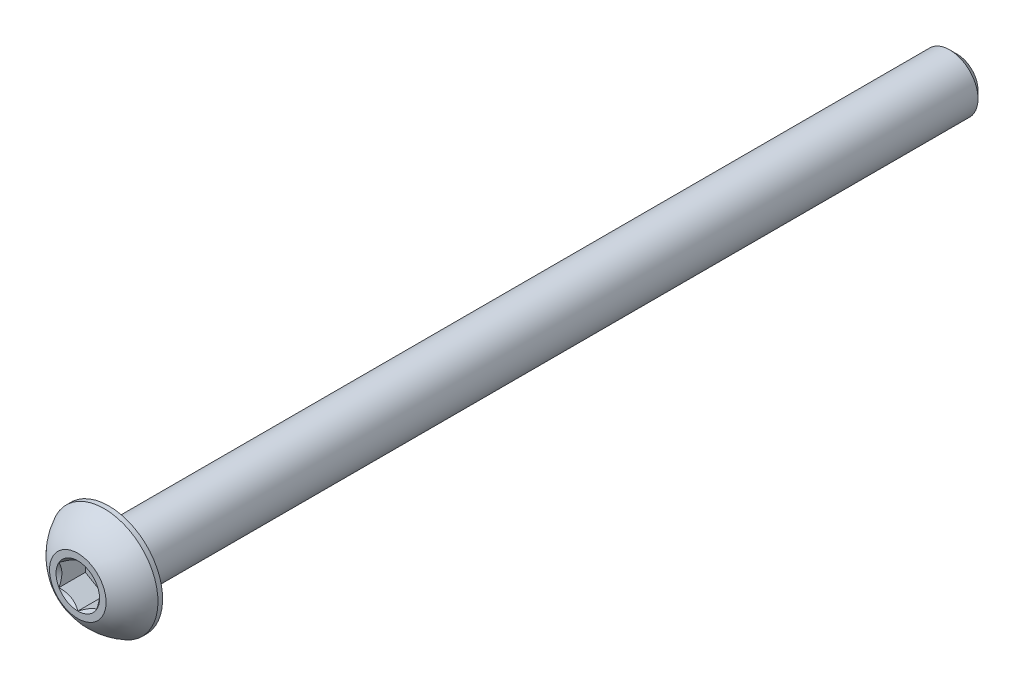
ISO-10303-21;
HEADER;
FILE_DESCRIPTION(('STEP AP214'),'2;1');
FILE_NAME('part.step','',(''),(''),'','','');
FILE_SCHEMA(('AUTOMOTIVE_DESIGN { 1 0 10303 214 1 1 1 1 }'));
ENDSEC;
DATA;
#1=APPLICATION_CONTEXT('core data for automotive mechanical design processes');
#2=APPLICATION_PROTOCOL_DEFINITION('international standard','automotive_design',2000,#1);
#3=PRODUCT_CONTEXT('',#1,'mechanical');
#4=PRODUCT('Part','Part','',(#3));
#5=PRODUCT_RELATED_PRODUCT_CATEGORY('part','',(#4));
#6=PRODUCT_DEFINITION_FORMATION('','',#4);
#7=PRODUCT_DEFINITION_CONTEXT('part definition',#1,'design');
#8=PRODUCT_DEFINITION('design','',#6,#7);
#9=PRODUCT_DEFINITION_SHAPE('','',#8);
#10=(LENGTH_UNIT() NAMED_UNIT(*) SI_UNIT(.MILLI.,.METRE.));
#11=(NAMED_UNIT(*) PLANE_ANGLE_UNIT() SI_UNIT($,.RADIAN.));
#12=(NAMED_UNIT(*) SI_UNIT($,.STERADIAN.) SOLID_ANGLE_UNIT());
#13=UNCERTAINTY_MEASURE_WITH_UNIT(LENGTH_MEASURE(1.E-05),#10,'distance_accuracy_value','');
#14=(GEOMETRIC_REPRESENTATION_CONTEXT(3) GLOBAL_UNCERTAINTY_ASSIGNED_CONTEXT((#13)) GLOBAL_UNIT_ASSIGNED_CONTEXT((#10,
#11,#12)) REPRESENTATION_CONTEXT('',''));
#15=CARTESIAN_POINT('',(0.,0.,0.));
#16=DIRECTION('',(0.,0.,1.));
#17=DIRECTION('',(1.,0.,0.));
#18=AXIS2_PLACEMENT_3D('',#15,#16,#17);
#19=CARTESIAN_POINT('',(1.,0.577350269189626,4.425));
#20=DIRECTION('',(0.5,0.866025403784439,0.));
#21=DIRECTION('',(0.,0.,-1.));
#22=AXIS2_PLACEMENT_3D('',#19,#20,#21);
#23=PLANE('',#22);
#24=DIRECTION('',(0.,0.,1.));
#25=VECTOR('',#24,1.);
#26=CARTESIAN_POINT('',(1.,0.577350269189626,4.425));
#27=LINE('',#26,#25);
#28=CARTESIAN_POINT('',(1.,0.577350269189626,4.425));
#29=VERTEX_POINT('',#28);
#30=CARTESIAN_POINT('',(1.,0.577350269189626,5.825));
#31=VERTEX_POINT('',#30);
#32=EDGE_CURVE('E11',#29,#31,#27,.T.);
#33=ORIENTED_EDGE('',*,*,#32,.T.);
#34=CARTESIAN_POINT('',(0.999999999999952,0.577350269189654,5.82499999999997));
#35=CARTESIAN_POINT('',(0.500000000000001,0.866025403784439,5.53632486540521));
#36=CARTESIAN_POINT('',(0.,1.15470053837922,5.82499999999997));
#37=(BOUNDED_CURVE() B_SPLINE_CURVE(2,(#34,#35,#36),.UNSPECIFIED.,.F.,
.F.) B_SPLINE_CURVE_WITH_KNOTS((3,3),(-0.3218671551163,-0.124274873543865),
.UNSPECIFIED.) CURVE() GEOMETRIC_REPRESENTATION_ITEM() RATIONAL_B_SPLINE_CURVE((1.46410161513777,
1.69059892324148,1.46410161513778)) REPRESENTATION_ITEM(''));
#38=CARTESIAN_POINT('',(0.,1.15470053837925,5.825));
#39=VERTEX_POINT('',#38);
#40=EDGE_CURVE('E105',#31,#39,#37,.T.);
#41=ORIENTED_EDGE('',*,*,#40,.T.);
#42=DIRECTION('',(0.,0.,1.));
#43=VECTOR('',#42,1.);
#44=CARTESIAN_POINT('',(0.,1.15470053837925,4.425));
#45=LINE('',#44,#43);
#46=CARTESIAN_POINT('',(0.,1.15470053837925,4.425));
#47=VERTEX_POINT('',#46);
#48=EDGE_CURVE('E100',#47,#39,#45,.T.);
#49=ORIENTED_EDGE('',*,*,#48,.F.);
#50=DIRECTION('',(-0.866025403784439,0.5,0.));
#51=VECTOR('',#50,1.);
#52=CARTESIAN_POINT('',(1.,0.577350269189626,4.425));
#53=LINE('',#52,#51);
#54=EDGE_CURVE('E96',#29,#47,#53,.T.);
#55=ORIENTED_EDGE('',*,*,#54,.F.);
#56=EDGE_LOOP('',(#33,#41,#49,#55));
#57=FACE_BOUND('',#56,.T.);
#58=ADVANCED_FACE('F17',(#57),#23,.F.);
#59=CARTESIAN_POINT('',(1.,-0.577350269189626,4.425));
#60=DIRECTION('',(1.,0.,0.));
#61=DIRECTION('',(0.,1.,0.));
#62=AXIS2_PLACEMENT_3D('',#59,#60,#61);
#63=PLANE('',#62);
#64=DIRECTION('',(0.,0.,1.));
#65=VECTOR('',#64,1.);
#66=CARTESIAN_POINT('',(1.,-0.577350269189626,4.425));
#67=LINE('',#66,#65);
#68=CARTESIAN_POINT('',(1.,-0.577350269189626,4.425));
#69=VERTEX_POINT('',#68);
#70=CARTESIAN_POINT('',(1.,-0.577350269189626,5.825));
#71=VERTEX_POINT('',#70);
#72=EDGE_CURVE('E25',#69,#71,#67,.T.);
#73=ORIENTED_EDGE('',*,*,#72,.T.);
#74=CARTESIAN_POINT('',(1.,-0.577350269189566,5.82499999999997));
#75=CARTESIAN_POINT('',(1.,0.,5.53632486540521));
#76=CARTESIAN_POINT('',(1.,0.577350269189569,5.82499999999997));
#77=(BOUNDED_CURVE() B_SPLINE_CURVE(2,(#74,#75,#76),.UNSPECIFIED.,.F.,
.F.) B_SPLINE_CURVE_WITH_KNOTS((3,3),(-0.321867155116299,-0.124274873543865),
.UNSPECIFIED.) CURVE() GEOMETRIC_REPRESENTATION_ITEM() RATIONAL_B_SPLINE_CURVE((1.46410161513778,
1.69059892324148,1.46410161513778)) REPRESENTATION_ITEM(''));
#78=EDGE_CURVE('E87',#71,#31,#77,.T.);
#79=ORIENTED_EDGE('',*,*,#78,.T.);
#80=ORIENTED_EDGE('',*,*,#32,.F.);
#81=DIRECTION('',(0.,1.,0.));
#82=VECTOR('',#81,1.);
#83=CARTESIAN_POINT('',(1.,-0.577350269189626,4.425));
#84=LINE('',#83,#82);
#85=EDGE_CURVE('E83',#69,#29,#84,.T.);
#86=ORIENTED_EDGE('',*,*,#85,.F.);
#87=EDGE_LOOP('',(#73,#79,#80,#86));
#88=FACE_BOUND('',#87,.T.);
#89=ADVANCED_FACE('F82',(#88),#63,.F.);
#90=CARTESIAN_POINT('',(0.,-1.15470053837925,4.425));
#91=DIRECTION('',(0.5,-0.866025403784439,0.));
#92=DIRECTION('',(0.,0.,-1.));
#93=AXIS2_PLACEMENT_3D('',#90,#91,#92);
#94=PLANE('',#93);
#95=DIRECTION('',(0.,0.,1.));
#96=VECTOR('',#95,1.);
#97=CARTESIAN_POINT('',(0.,-1.15470053837925,4.425));
#98=LINE('',#97,#96);
#99=CARTESIAN_POINT('',(0.,-1.15470053837925,4.425));
#100=VERTEX_POINT('',#99);
#101=CARTESIAN_POINT('',(0.,-1.15470053837925,5.825));
#102=VERTEX_POINT('',#101);
#103=EDGE_CURVE('E49',#100,#102,#98,.T.);
#104=ORIENTED_EDGE('',*,*,#103,.T.);
#105=CARTESIAN_POINT('',(0.,-1.15470053837922,5.82499999999997));
#106=CARTESIAN_POINT('',(0.5,-0.866025403784439,5.53632486540521));
#107=CARTESIAN_POINT('',(0.999999999999951,-0.577350269189654,5.82499999999997));
#108=(BOUNDED_CURVE() B_SPLINE_CURVE(2,(#105,#106,#107),.UNSPECIFIED.,.F.,
.F.) B_SPLINE_CURVE_WITH_KNOTS((3,3),(-0.3218671551163,-0.124274873543865),
.UNSPECIFIED.) CURVE() GEOMETRIC_REPRESENTATION_ITEM() RATIONAL_B_SPLINE_CURVE((1.46410161513777,
1.69059892324148,1.46410161513778)) REPRESENTATION_ITEM(''));
#109=EDGE_CURVE('E114',#102,#71,#108,.T.);
#110=ORIENTED_EDGE('',*,*,#109,.T.);
#111=ORIENTED_EDGE('',*,*,#72,.F.);
#112=DIRECTION('',(0.866025403784439,0.5,0.));
#113=VECTOR('',#112,1.);
#114=CARTESIAN_POINT('',(0.,-1.15470053837925,4.425));
#115=LINE('',#114,#113);
#116=EDGE_CURVE('E98',#100,#69,#115,.T.);
#117=ORIENTED_EDGE('',*,*,#116,.F.);
#118=EDGE_LOOP('',(#104,#110,#111,#117));
#119=FACE_BOUND('',#118,.T.);
#120=ADVANCED_FACE('F245',(#119),#94,.F.);
#121=CARTESIAN_POINT('',(-1.,-0.577350269189625,4.425));
#122=DIRECTION('',(-0.5,-0.866025403784439,0.));
#123=DIRECTION('',(-0.866025403784439,0.5,0.));
#124=AXIS2_PLACEMENT_3D('',#121,#122,#123);
#125=PLANE('',#124);
#126=DIRECTION('',(0.,0.,1.));
#127=VECTOR('',#126,1.);
#128=CARTESIAN_POINT('',(-1.,-0.577350269189625,4.425));
#129=LINE('',#128,#127);
#130=CARTESIAN_POINT('',(-1.,-0.577350269189625,4.425));
#131=VERTEX_POINT('',#130);
#132=CARTESIAN_POINT('',(-1.,-0.577350269189626,5.825));
#133=VERTEX_POINT('',#132);
#134=EDGE_CURVE('E233',#131,#133,#129,.T.);
#135=ORIENTED_EDGE('',*,*,#134,.T.);
#136=CARTESIAN_POINT('',(-0.999999999999951,-0.577350269189654,5.82499999999997));
#137=CARTESIAN_POINT('',(-0.500000000000001,-0.866025403784439,5.53632486540521));
#138=CARTESIAN_POINT('',(0.,-1.15470053837922,5.82499999999997));
#139=(BOUNDED_CURVE() B_SPLINE_CURVE(2,(#136,#137,#138),.UNSPECIFIED.,.F.,
.F.) B_SPLINE_CURVE_WITH_KNOTS((3,3),(-0.3218671551163,-0.124274873543866),
.UNSPECIFIED.) CURVE() GEOMETRIC_REPRESENTATION_ITEM() RATIONAL_B_SPLINE_CURVE((1.46410161513777,
1.69059892324148,1.46410161513777)) REPRESENTATION_ITEM(''));
#140=EDGE_CURVE('E197',#133,#102,#139,.T.);
#141=ORIENTED_EDGE('',*,*,#140,.T.);
#142=ORIENTED_EDGE('',*,*,#103,.F.);
#143=DIRECTION('',(0.866025403784439,-0.5,0.));
#144=VECTOR('',#143,1.);
#145=CARTESIAN_POINT('',(-1.,-0.577350269189625,4.425));
#146=LINE('',#145,#144);
#147=EDGE_CURVE('E223',#131,#100,#146,.T.);
#148=ORIENTED_EDGE('',*,*,#147,.F.);
#149=EDGE_LOOP('',(#135,#141,#142,#148));
#150=FACE_BOUND('',#149,.T.);
#151=ADVANCED_FACE('F279',(#150),#125,.F.);
#152=CARTESIAN_POINT('',(-1.,0.577350269189626,4.425));
#153=DIRECTION('',(-1.,0.,0.));
#154=DIRECTION('',(0.,0.,1.));
#155=AXIS2_PLACEMENT_3D('',#152,#153,#154);
#156=PLANE('',#155);
#157=DIRECTION('',(0.,0.,1.));
#158=VECTOR('',#157,1.);
#159=CARTESIAN_POINT('',(-1.,0.577350269189626,4.425));
#160=LINE('',#159,#158);
#161=CARTESIAN_POINT('',(-1.,0.577350269189626,4.425));
#162=VERTEX_POINT('',#161);
#163=CARTESIAN_POINT('',(-1.,0.577350269189627,5.825));
#164=VERTEX_POINT('',#163);
#165=EDGE_CURVE('E229',#162,#164,#160,.T.);
#166=ORIENTED_EDGE('',*,*,#165,.T.);
#167=CARTESIAN_POINT('',(-1.,0.577350269189572,5.82499999999997));
#168=CARTESIAN_POINT('',(-1.,0.,5.53632486540521));
#169=CARTESIAN_POINT('',(-1.,-0.577350269189569,5.82499999999997));
#170=(BOUNDED_CURVE() B_SPLINE_CURVE(2,(#167,#168,#169),.UNSPECIFIED.,.F.,
.F.) B_SPLINE_CURVE_WITH_KNOTS((3,3),(-0.3218671551163,-0.124274873543865),
.UNSPECIFIED.) CURVE() GEOMETRIC_REPRESENTATION_ITEM() RATIONAL_B_SPLINE_CURVE((1.46410161513777,
1.69059892324148,1.46410161513778)) REPRESENTATION_ITEM(''));
#171=EDGE_CURVE('E188',#164,#133,#170,.T.);
#172=ORIENTED_EDGE('',*,*,#171,.T.);
#173=ORIENTED_EDGE('',*,*,#134,.F.);
#174=DIRECTION('',(0.,-1.,0.));
#175=VECTOR('',#174,1.);
#176=CARTESIAN_POINT('',(-1.,0.577350269189626,4.425));
#177=LINE('',#176,#175);
#178=EDGE_CURVE('E112',#162,#131,#177,.T.);
#179=ORIENTED_EDGE('',*,*,#178,.F.);
#180=EDGE_LOOP('',(#166,#172,#173,#179));
#181=FACE_BOUND('',#180,.T.);
#182=ADVANCED_FACE('F284',(#181),#156,.F.);
#183=CARTESIAN_POINT('',(0.,1.15470053837925,4.425));
#184=DIRECTION('',(-0.5,0.866025403784439,0.));
#185=DIRECTION('',(0.,0.,1.));
#186=AXIS2_PLACEMENT_3D('',#183,#184,#185);
#187=PLANE('',#186);
#188=ORIENTED_EDGE('',*,*,#48,.T.);
#189=CARTESIAN_POINT('',(0.,1.15470053837922,5.82499999999997));
#190=CARTESIAN_POINT('',(-0.500000000000001,0.866025403784439,5.53632486540521));
#191=CARTESIAN_POINT('',(-0.999999999999948,0.577350269189656,5.82499999999997));
#192=(BOUNDED_CURVE() B_SPLINE_CURVE(2,(#189,#190,#191),.UNSPECIFIED.,.F.,
.F.) B_SPLINE_CURVE_WITH_KNOTS((3,3),(-0.321867155116299,-0.124274873543865),
.UNSPECIFIED.) CURVE() GEOMETRIC_REPRESENTATION_ITEM() RATIONAL_B_SPLINE_CURVE((1.46410161513778,
1.69059892324148,1.46410161513778)) REPRESENTATION_ITEM(''));
#193=EDGE_CURVE('E167',#39,#164,#192,.T.);
#194=ORIENTED_EDGE('',*,*,#193,.T.);
#195=ORIENTED_EDGE('',*,*,#165,.F.);
#196=DIRECTION('',(-0.866025403784439,-0.5,0.));
#197=VECTOR('',#196,1.);
#198=CARTESIAN_POINT('',(0.,1.15470053837925,4.425));
#199=LINE('',#198,#197);
#200=EDGE_CURVE('E104',#47,#162,#199,.T.);
#201=ORIENTED_EDGE('',*,*,#200,.F.);
#202=EDGE_LOOP('',(#188,#194,#195,#201));
#203=FACE_BOUND('',#202,.T.);
#204=ADVANCED_FACE('F285',(#203),#187,.F.);
#205=CARTESIAN_POINT('',(0.,0.,4.425));
#206=DIRECTION('',(0.,0.,1.));
#207=DIRECTION('',(1.,0.,0.));
#208=AXIS2_PLACEMENT_3D('',#205,#206,#207);
#209=PLANE('',#208);
#210=ORIENTED_EDGE('',*,*,#54,.T.);
#211=ORIENTED_EDGE('',*,*,#200,.T.);
#212=ORIENTED_EDGE('',*,*,#178,.T.);
#213=ORIENTED_EDGE('',*,*,#147,.T.);
#214=ORIENTED_EDGE('',*,*,#116,.T.);
#215=ORIENTED_EDGE('',*,*,#85,.T.);
#216=EDGE_LOOP('',(#210,#211,#212,#213,#214,#215));
#217=FACE_BOUND('',#216,.T.);
#218=ADVANCED_FACE('F94',(#217),#209,.T.);
#219=CARTESIAN_POINT('',(0.,0.,5.825));
#220=DIRECTION('',(0.,0.,1.));
#221=DIRECTION('',(1.,0.,0.));
#222=AXIS2_PLACEMENT_3D('',#219,#220,#221);
#223=CONICAL_SURFACE('',#222,1.15470053837925,0.78539816339745);
#224=CARTESIAN_POINT('',(0.,0.,5.825));
#225=DIRECTION('',(0.,0.,1.));
#226=DIRECTION('',(1.,0.,0.));
#227=AXIS2_PLACEMENT_3D('',#224,#225,#226);
#228=CIRCLE('',#227,1.15470053837925);
#229=EDGE_CURVE('E176',#31,#39,#228,.T.);
#230=ORIENTED_EDGE('',*,*,#229,.T.);
#231=ORIENTED_EDGE('',*,*,#40,.F.);
#232=EDGE_LOOP('',(#230,#231));
#233=FACE_BOUND('',#232,.T.);
#234=ADVANCED_FACE('F294',(#233),#223,.F.);
#235=CARTESIAN_POINT('',(0.,0.,5.825));
#236=DIRECTION('',(0.,0.,1.));
#237=DIRECTION('',(1.,0.,0.));
#238=AXIS2_PLACEMENT_3D('',#235,#236,#237);
#239=CONICAL_SURFACE('',#238,1.15470053837925,0.78539816339745);
#240=CARTESIAN_POINT('',(0.,0.,5.825));
#241=DIRECTION('',(0.,0.,1.));
#242=DIRECTION('',(1.,0.,0.));
#243=AXIS2_PLACEMENT_3D('',#240,#241,#242);
#244=CIRCLE('',#243,1.15470053837925);
#245=EDGE_CURVE('E118',#102,#71,#244,.T.);
#246=ORIENTED_EDGE('',*,*,#245,.T.);
#247=ORIENTED_EDGE('',*,*,#109,.F.);
#248=EDGE_LOOP('',(#246,#247));
#249=FACE_BOUND('',#248,.T.);
#250=ADVANCED_FACE('F249',(#249),#239,.F.);
#251=CARTESIAN_POINT('',(0.,0.,5.825));
#252=DIRECTION('',(0.,0.,1.));
#253=DIRECTION('',(1.,0.,0.));
#254=AXIS2_PLACEMENT_3D('',#251,#252,#253);
#255=CONICAL_SURFACE('',#254,1.15470053837925,0.78539816339745);
#256=CARTESIAN_POINT('',(0.,0.,5.825));
#257=DIRECTION('',(0.,0.,1.));
#258=DIRECTION('',(1.,0.,0.));
#259=AXIS2_PLACEMENT_3D('',#256,#257,#258);
#260=CIRCLE('',#259,1.15470053837925);
#261=EDGE_CURVE('E168',#133,#102,#260,.T.);
#262=ORIENTED_EDGE('',*,*,#261,.T.);
#263=ORIENTED_EDGE('',*,*,#140,.F.);
#264=EDGE_LOOP('',(#262,#263));
#265=FACE_BOUND('',#264,.T.);
#266=ADVANCED_FACE('F295',(#265),#255,.F.);
#267=CARTESIAN_POINT('',(0.,0.,5.825));
#268=DIRECTION('',(0.,0.,1.));
#269=DIRECTION('',(-1.,0.,0.));
#270=AXIS2_PLACEMENT_3D('',#267,#268,#269);
#271=CONICAL_SURFACE('',#270,1.15470053837925,0.78539816339745);
#272=CARTESIAN_POINT('',(0.,0.,5.825));
#273=DIRECTION('',(0.,0.,1.));
#274=DIRECTION('',(1.,0.,0.));
#275=AXIS2_PLACEMENT_3D('',#272,#273,#274);
#276=CIRCLE('',#275,1.15470053837925);
#277=EDGE_CURVE('E163',#164,#133,#276,.T.);
#278=ORIENTED_EDGE('',*,*,#277,.T.);
#279=ORIENTED_EDGE('',*,*,#171,.F.);
#280=EDGE_LOOP('',(#278,#279));
#281=FACE_BOUND('',#280,.T.);
#282=ADVANCED_FACE('F298',(#281),#271,.F.);
#283=CARTESIAN_POINT('',(0.,0.,5.825));
#284=DIRECTION('',(0.,0.,1.));
#285=DIRECTION('',(1.,0.,0.));
#286=AXIS2_PLACEMENT_3D('',#283,#284,#285);
#287=CONICAL_SURFACE('',#286,1.15470053837925,0.78539816339745);
#288=CARTESIAN_POINT('',(0.,0.,5.825));
#289=DIRECTION('',(0.,0.,1.));
#290=DIRECTION('',(1.,0.,0.));
#291=AXIS2_PLACEMENT_3D('',#288,#289,#290);
#292=CIRCLE('',#291,1.15470053837925);
#293=EDGE_CURVE('E172',#39,#164,#292,.T.);
#294=ORIENTED_EDGE('',*,*,#293,.T.);
#295=ORIENTED_EDGE('',*,*,#193,.F.);
#296=EDGE_LOOP('',(#294,#295));
#297=FACE_BOUND('',#296,.T.);
#298=ADVANCED_FACE('F304',(#297),#287,.F.);
#299=CARTESIAN_POINT('',(0.,0.,-40.825));
#300=DIRECTION('',(0.,0.,1.));
#301=DIRECTION('',(0.,-1.,0.));
#302=AXIS2_PLACEMENT_3D('',#299,#300,#301);
#303=PLANE('',#302);
#304=CARTESIAN_POINT('',(0.,0.,-40.825));
#305=DIRECTION('',(0.,0.,1.));
#306=DIRECTION('',(0.,-1.,0.));
#307=AXIS2_PLACEMENT_3D('',#304,#305,#306);
#308=CIRCLE('',#307,1.1);
#309=CARTESIAN_POINT('',(0.,1.1,-40.825));
#310=VERTEX_POINT('',#309);
#311=EDGE_CURVE('E148',#310,#310,#308,.T.);
#312=ORIENTED_EDGE('',*,*,#311,.F.);
#313=EDGE_LOOP('',(#312));
#314=FACE_BOUND('',#313,.T.);
#315=ADVANCED_FACE('F300',(#314),#303,.F.);
#316=CARTESIAN_POINT('',(0.,1.5,4.175));
#317=DIRECTION('',(0.,0.,1.));
#318=DIRECTION('',(0.,-1.,0.));
#319=AXIS2_PLACEMENT_3D('',#316,#317,#318);
#320=PLANE('',#319);
#321=CARTESIAN_POINT('',(0.,0.,4.175));
#322=DIRECTION('',(0.,0.,1.));
#323=DIRECTION('',(0.,-1.,0.));
#324=AXIS2_PLACEMENT_3D('',#321,#322,#323);
#325=CIRCLE('',#324,1.5);
#326=CARTESIAN_POINT('',(0.,1.5,4.175));
#327=VERTEX_POINT('',#326);
#328=EDGE_CURVE('E132',#327,#327,#325,.T.);
#329=ORIENTED_EDGE('',*,*,#328,.T.);
#330=EDGE_LOOP('',(#329));
#331=FACE_BOUND('',#330,.T.);
#332=CARTESIAN_POINT('',(0.,0.,4.175));
#333=DIRECTION('',(0.,0.,1.));
#334=DIRECTION('',(0.,-1.,0.));
#335=AXIS2_PLACEMENT_3D('',#332,#333,#334);
#336=CIRCLE('',#335,2.85);
#337=CARTESIAN_POINT('',(0.,2.85,4.175));
#338=VERTEX_POINT('',#337);
#339=EDGE_CURVE('E158',#338,#338,#336,.T.);
#340=ORIENTED_EDGE('',*,*,#339,.F.);
#341=EDGE_LOOP('',(#340));
#342=FACE_BOUND('',#341,.T.);
#343=ADVANCED_FACE('F303',(#331,#342),#320,.F.);
#344=CARTESIAN_POINT('',(0.,0.,5.825));
#345=DIRECTION('',(0.,0.,-1.));
#346=DIRECTION('',(0.,-1.,0.));
#347=AXIS2_PLACEMENT_3D('',#344,#345,#346);
#348=PLANE('',#347);
#349=ORIENTED_EDGE('',*,*,#293,.F.);
#350=ORIENTED_EDGE('',*,*,#229,.F.);
#351=CARTESIAN_POINT('',(0.,0.,5.825));
#352=DIRECTION('',(0.,0.,1.));
#353=DIRECTION('',(1.,0.,0.));
#354=AXIS2_PLACEMENT_3D('',#351,#352,#353);
#355=CIRCLE('',#354,1.15470053837925);
#356=EDGE_CURVE('E123',#71,#31,#355,.T.);
#357=ORIENTED_EDGE('',*,*,#356,.F.);
#358=ORIENTED_EDGE('',*,*,#245,.F.);
#359=ORIENTED_EDGE('',*,*,#261,.F.);
#360=ORIENTED_EDGE('',*,*,#277,.F.);
#361=EDGE_LOOP('',(#349,#350,#357,#358,#359,#360));
#362=FACE_BOUND('',#361,.T.);
#363=CARTESIAN_POINT('',(0.,0.,5.825));
#364=DIRECTION('',(0.,0.,1.));
#365=DIRECTION('',(0.,-1.,0.));
#366=AXIS2_PLACEMENT_3D('',#363,#364,#365);
#367=CIRCLE('',#366,1.5);
#368=CARTESIAN_POINT('',(0.,1.5,5.825));
#369=VERTEX_POINT('',#368);
#370=EDGE_CURVE('E162',#369,#369,#367,.T.);
#371=ORIENTED_EDGE('',*,*,#370,.T.);
#372=EDGE_LOOP('',(#371));
#373=FACE_BOUND('',#372,.T.);
#374=ADVANCED_FACE('F255',(#362,#373),#348,.F.);
#375=CARTESIAN_POINT('',(0.,0.,3.03016711229946));
#376=DIRECTION('',(-1.,0.,0.));
#377=DIRECTION('',(0.,1.,0.));
#378=AXIS2_PLACEMENT_3D('',#375,#376,#377);
#379=SPHERICAL_SURFACE('',#378,3.17192226735973);
#380=CARTESIAN_POINT('',(0.,0.,3.03016711229946));
#381=DIRECTION('',(0.,0.,1.));
#382=DIRECTION('',(0.,-1.,0.));
#383=AXIS2_PLACEMENT_3D('',#380,#381,#382);
#384=SPHERICAL_SURFACE('',#383,3.17192226735973);
#385=ORIENTED_EDGE('',*,*,#370,.F.);
#386=EDGE_LOOP('',(#385));
#387=FACE_BOUND('',#386,.T.);
#388=CARTESIAN_POINT('',(0.,0.,4.4225));
#389=DIRECTION('',(0.,0.,1.));
#390=DIRECTION('',(0.,-1.,0.));
#391=AXIS2_PLACEMENT_3D('',#388,#389,#390);
#392=CIRCLE('',#391,2.85);
#393=CARTESIAN_POINT('',(0.,2.85,4.4225));
#394=VERTEX_POINT('',#393);
#395=EDGE_CURVE('E131',#394,#394,#392,.T.);
#396=ORIENTED_EDGE('',*,*,#395,.T.);
#397=EDGE_LOOP('',(#396));
#398=FACE_BOUND('',#397,.T.);
#399=ADVANCED_FACE('F316',(#387,#398),#384,.T.);
#400=CARTESIAN_POINT('',(0.,0.,5.825));
#401=DIRECTION('',(0.,0.,1.));
#402=DIRECTION('',(0.,-1.,0.));
#403=AXIS2_PLACEMENT_3D('',#400,#401,#402);
#404=CYLINDRICAL_SURFACE('',#403,2.85);
#405=ORIENTED_EDGE('',*,*,#395,.F.);
#406=DIRECTION('',(0.,0.,-1.));
#407=VECTOR('',#406,1.);
#408=CARTESIAN_POINT('',(0.,2.85,5.825));
#409=LINE('',#408,#407);
#410=EDGE_CURVE('E144',#394,#338,#409,.T.);
#411=ORIENTED_EDGE('',*,*,#410,.T.);
#412=ORIENTED_EDGE('',*,*,#339,.T.);
#413=ORIENTED_EDGE('',*,*,#410,.F.);
#414=EDGE_LOOP('',(#405,#411,#412,#413));
#415=FACE_BOUND('',#414,.T.);
#416=ADVANCED_FACE('F319',(#415),#404,.T.);
#417=CARTESIAN_POINT('',(0.,0.,5.825));
#418=DIRECTION('',(0.,0.,1.));
#419=DIRECTION('',(0.,-1.,0.));
#420=AXIS2_PLACEMENT_3D('',#417,#418,#419);
#421=CYLINDRICAL_SURFACE('',#420,1.5);
#422=ORIENTED_EDGE('',*,*,#328,.F.);
#423=DIRECTION('',(0.,0.,-1.));
#424=VECTOR('',#423,1.);
#425=CARTESIAN_POINT('',(0.,1.5,5.825));
#426=LINE('',#425,#424);
#427=CARTESIAN_POINT('',(0.,1.5,-40.425));
#428=VERTEX_POINT('',#427);
#429=EDGE_CURVE('E124',#327,#428,#426,.T.);
#430=ORIENTED_EDGE('',*,*,#429,.T.);
#431=CARTESIAN_POINT('',(0.,0.,-40.425));
#432=DIRECTION('',(0.,0.,1.));
#433=DIRECTION('',(0.,-1.,0.));
#434=AXIS2_PLACEMENT_3D('',#431,#432,#433);
#435=CIRCLE('',#434,1.5);
#436=EDGE_CURVE('E136',#428,#428,#435,.T.);
#437=ORIENTED_EDGE('',*,*,#436,.T.);
#438=ORIENTED_EDGE('',*,*,#429,.F.);
#439=EDGE_LOOP('',(#422,#430,#437,#438));
#440=FACE_BOUND('',#439,.T.);
#441=ADVANCED_FACE('F267',(#440),#421,.T.);
#442=CARTESIAN_POINT('',(0.,0.,-40.825));
#443=DIRECTION('',(0.,0.,1.));
#444=DIRECTION('',(0.,-1.,0.));
#445=AXIS2_PLACEMENT_3D('',#442,#443,#444);
#446=CONICAL_SURFACE('',#445,1.1,0.785398163397444);
#447=ORIENTED_EDGE('',*,*,#436,.F.);
#448=DIRECTION('',(0.,-0.707106781186545,-0.707106781186551));
#449=VECTOR('',#448,1.);
#450=CARTESIAN_POINT('',(0.,1.1,-40.825));
#451=LINE('',#450,#449);
#452=EDGE_CURVE('E140',#428,#310,#451,.T.);
#453=ORIENTED_EDGE('',*,*,#452,.T.);
#454=ORIENTED_EDGE('',*,*,#311,.T.);
#455=ORIENTED_EDGE('',*,*,#452,.F.);
#456=EDGE_LOOP('',(#447,#453,#454,#455));
#457=FACE_BOUND('',#456,.T.);
#458=ADVANCED_FACE('F260',(#457),#446,.T.);
#459=CARTESIAN_POINT('',(0.,0.,5.825));
#460=DIRECTION('',(0.,0.,1.));
#461=DIRECTION('',(1.,0.,0.));
#462=AXIS2_PLACEMENT_3D('',#459,#460,#461);
#463=CONICAL_SURFACE('',#462,1.15470053837925,0.78539816339745);
#464=ORIENTED_EDGE('',*,*,#78,.F.);
#465=ORIENTED_EDGE('',*,*,#356,.T.);
#466=EDGE_LOOP('',(#464,#465));
#467=FACE_BOUND('',#466,.T.);
#468=ADVANCED_FACE('F258',(#467),#463,.F.);
#469=CLOSED_SHELL('',(#58,#89,#120,#151,#182,#204,#218,#234,#250,#266,#282,#298,#315,#343,#374,
#399,#416,#441,#458,#468));
#470=MANIFOLD_SOLID_BREP('B1',#469);
#471=ADVANCED_BREP_SHAPE_REPRESENTATION('',(#18,#470),#14);
#472=SHAPE_DEFINITION_REPRESENTATION(#9,#471);
ENDSEC;
END-ISO-10303-21;
